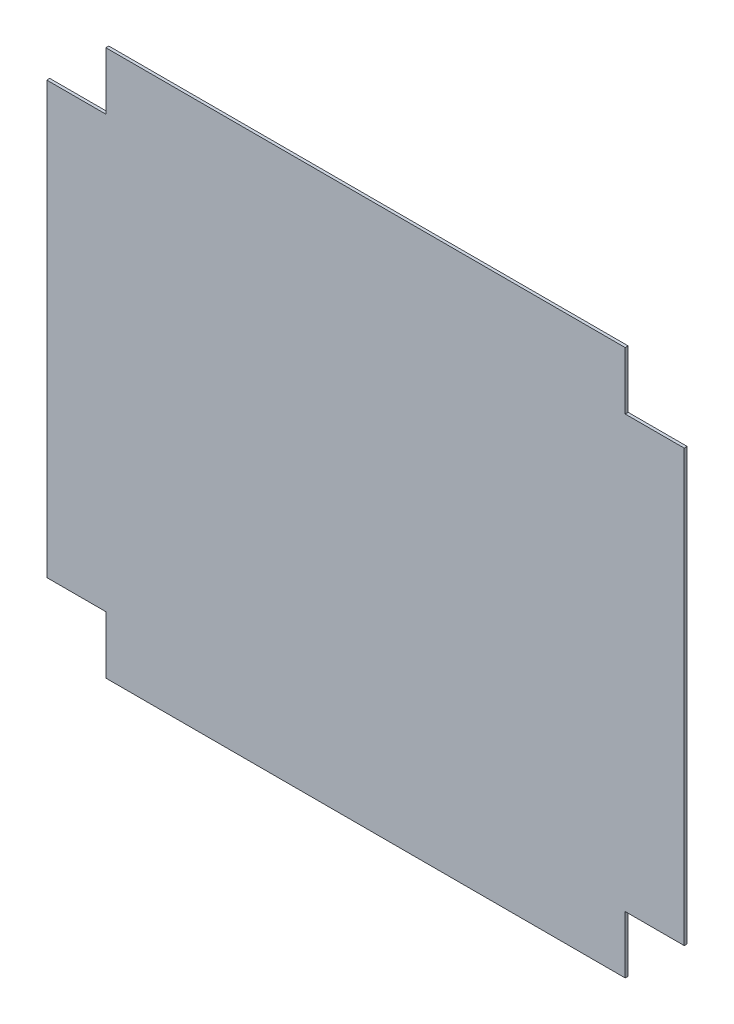
ISO-10303-21;
HEADER;
FILE_DESCRIPTION(('STEP AP214'),'2;1');
FILE_NAME('part.step','',(''),(''),'','','');
FILE_SCHEMA(('AUTOMOTIVE_DESIGN { 1 0 10303 214 1 1 1 1 }'));
ENDSEC;
DATA;
#1=APPLICATION_CONTEXT('core data for automotive mechanical design processes');
#2=APPLICATION_PROTOCOL_DEFINITION('international standard','automotive_design',2000,#1);
#3=PRODUCT_CONTEXT('',#1,'mechanical');
#4=PRODUCT('Part','Part','',(#3));
#5=PRODUCT_RELATED_PRODUCT_CATEGORY('part','',(#4));
#6=PRODUCT_DEFINITION_FORMATION('','',#4);
#7=PRODUCT_DEFINITION_CONTEXT('part definition',#1,'design');
#8=PRODUCT_DEFINITION('design','',#6,#7);
#9=PRODUCT_DEFINITION_SHAPE('','',#8);
#10=(LENGTH_UNIT() NAMED_UNIT(*) SI_UNIT(.MILLI.,.METRE.));
#11=(NAMED_UNIT(*) PLANE_ANGLE_UNIT() SI_UNIT($,.RADIAN.));
#12=(NAMED_UNIT(*) SI_UNIT($,.STERADIAN.) SOLID_ANGLE_UNIT());
#13=UNCERTAINTY_MEASURE_WITH_UNIT(LENGTH_MEASURE(1.E-05),#10,'distance_accuracy_value','');
#14=(GEOMETRIC_REPRESENTATION_CONTEXT(3) GLOBAL_UNCERTAINTY_ASSIGNED_CONTEXT((#13)) GLOBAL_UNIT_ASSIGNED_CONTEXT((#10,
#11,#12)) REPRESENTATION_CONTEXT('',''));
#15=CARTESIAN_POINT('',(0.,0.,0.));
#16=DIRECTION('',(0.,0.,1.));
#17=DIRECTION('',(1.,0.,0.));
#18=AXIS2_PLACEMENT_3D('',#15,#16,#17);
#19=CARTESIAN_POINT('',(-216.,-185.,2.));
#20=DIRECTION('',(1.,0.,0.));
#21=DIRECTION('',(0.,0.,-1.));
#22=AXIS2_PLACEMENT_3D('',#19,#20,#21);
#23=PLANE('',#22);
#24=DIRECTION('',(0.,-1.,0.));
#25=VECTOR('',#24,1.);
#26=CARTESIAN_POINT('',(-216.,-185.,0.));
#27=LINE('',#26,#25);
#28=CARTESIAN_POINT('',(-216.,146.,0.));
#29=VERTEX_POINT('',#28);
#30=CARTESIAN_POINT('',(-216.,-146.,0.));
#31=VERTEX_POINT('',#30);
#32=EDGE_CURVE('E167',#29,#31,#27,.T.);
#33=ORIENTED_EDGE('',*,*,#32,.T.);
#34=DIRECTION('',(0.,0.,1.));
#35=VECTOR('',#34,1.);
#36=CARTESIAN_POINT('',(-216.,-146.,0.));
#37=LINE('',#36,#35);
#38=CARTESIAN_POINT('',(-216.,-146.,2.));
#39=VERTEX_POINT('',#38);
#40=EDGE_CURVE('E209',#31,#39,#37,.T.);
#41=ORIENTED_EDGE('',*,*,#40,.T.);
#42=DIRECTION('',(0.,-1.,0.));
#43=VECTOR('',#42,1.);
#44=CARTESIAN_POINT('',(-216.,-185.,2.));
#45=LINE('',#44,#43);
#46=CARTESIAN_POINT('',(-216.,146.,2.));
#47=VERTEX_POINT('',#46);
#48=EDGE_CURVE('E163',#47,#39,#45,.T.);
#49=ORIENTED_EDGE('',*,*,#48,.F.);
#50=DIRECTION('',(0.,0.,1.));
#51=VECTOR('',#50,1.);
#52=CARTESIAN_POINT('',(-216.,146.,0.));
#53=LINE('',#52,#51);
#54=EDGE_CURVE('E182',#29,#47,#53,.T.);
#55=ORIENTED_EDGE('',*,*,#54,.F.);
#56=EDGE_LOOP('',(#33,#41,#49,#55));
#57=FACE_BOUND('',#56,.T.);
#58=ADVANCED_FACE('F43',(#57),#23,.F.);
#59=CARTESIAN_POINT('',(216.,-185.,2.));
#60=DIRECTION('',(0.,1.,0.));
#61=DIRECTION('',(-1.,0.,0.));
#62=AXIS2_PLACEMENT_3D('',#59,#60,#61);
#63=PLANE('',#62);
#64=DIRECTION('',(1.,0.,0.));
#65=VECTOR('',#64,1.);
#66=CARTESIAN_POINT('',(216.,-185.,2.));
#67=LINE('',#66,#65);
#68=CARTESIAN_POINT('',(-176.,-185.,2.));
#69=VERTEX_POINT('',#68);
#70=CARTESIAN_POINT('',(176.,-185.,2.));
#71=VERTEX_POINT('',#70);
#72=EDGE_CURVE('E160',#69,#71,#67,.T.);
#73=ORIENTED_EDGE('',*,*,#72,.F.);
#74=DIRECTION('',(0.,0.,1.));
#75=VECTOR('',#74,1.);
#76=CARTESIAN_POINT('',(-176.,-185.,0.));
#77=LINE('',#76,#75);
#78=CARTESIAN_POINT('',(-176.,-185.,0.));
#79=VERTEX_POINT('',#78);
#80=EDGE_CURVE('E203',#79,#69,#77,.T.);
#81=ORIENTED_EDGE('',*,*,#80,.F.);
#82=DIRECTION('',(1.,0.,0.));
#83=VECTOR('',#82,1.);
#84=CARTESIAN_POINT('',(216.,-185.,0.));
#85=LINE('',#84,#83);
#86=CARTESIAN_POINT('',(176.,-185.,0.));
#87=VERTEX_POINT('',#86);
#88=EDGE_CURVE('E170',#79,#87,#85,.T.);
#89=ORIENTED_EDGE('',*,*,#88,.T.);
#90=DIRECTION('',(0.,0.,1.));
#91=VECTOR('',#90,1.);
#92=CARTESIAN_POINT('',(176.,-185.,0.));
#93=LINE('',#92,#91);
#94=EDGE_CURVE('E207',#87,#71,#93,.T.);
#95=ORIENTED_EDGE('',*,*,#94,.T.);
#96=EDGE_LOOP('',(#73,#81,#89,#95));
#97=FACE_BOUND('',#96,.T.);
#98=ADVANCED_FACE('F258',(#97),#63,.F.);
#99=CARTESIAN_POINT('',(216.,-185.,2.));
#100=DIRECTION('',(-1.,0.,0.));
#101=DIRECTION('',(0.,0.,1.));
#102=AXIS2_PLACEMENT_3D('',#99,#100,#101);
#103=PLANE('',#102);
#104=DIRECTION('',(0.,1.,0.));
#105=VECTOR('',#104,1.);
#106=CARTESIAN_POINT('',(216.,-185.,2.));
#107=LINE('',#106,#105);
#108=CARTESIAN_POINT('',(216.,-146.,2.));
#109=VERTEX_POINT('',#108);
#110=CARTESIAN_POINT('',(216.,146.,2.));
#111=VERTEX_POINT('',#110);
#112=EDGE_CURVE('E51',#109,#111,#107,.T.);
#113=ORIENTED_EDGE('',*,*,#112,.F.);
#114=DIRECTION('',(0.,0.,1.));
#115=VECTOR('',#114,1.);
#116=CARTESIAN_POINT('',(216.,-146.,0.));
#117=LINE('',#116,#115);
#118=CARTESIAN_POINT('',(216.,-146.,0.));
#119=VERTEX_POINT('',#118);
#120=EDGE_CURVE('E220',#119,#109,#117,.T.);
#121=ORIENTED_EDGE('',*,*,#120,.F.);
#122=DIRECTION('',(0.,1.,0.));
#123=VECTOR('',#122,1.);
#124=CARTESIAN_POINT('',(216.,-185.,0.));
#125=LINE('',#124,#123);
#126=CARTESIAN_POINT('',(216.,146.,0.));
#127=VERTEX_POINT('',#126);
#128=EDGE_CURVE('E152',#119,#127,#125,.T.);
#129=ORIENTED_EDGE('',*,*,#128,.T.);
#130=DIRECTION('',(0.,0.,1.));
#131=VECTOR('',#130,1.);
#132=CARTESIAN_POINT('',(216.,146.,0.));
#133=LINE('',#132,#131);
#134=EDGE_CURVE('E135',#127,#111,#133,.T.);
#135=ORIENTED_EDGE('',*,*,#134,.T.);
#136=EDGE_LOOP('',(#113,#121,#129,#135));
#137=FACE_BOUND('',#136,.T.);
#138=ADVANCED_FACE('F149',(#137),#103,.F.);
#139=CARTESIAN_POINT('',(216.,185.,2.));
#140=DIRECTION('',(0.,-1.,0.));
#141=DIRECTION('',(1.,0.,0.));
#142=AXIS2_PLACEMENT_3D('',#139,#140,#141);
#143=PLANE('',#142);
#144=DIRECTION('',(-1.,0.,0.));
#145=VECTOR('',#144,1.);
#146=CARTESIAN_POINT('',(216.,185.,2.));
#147=LINE('',#146,#145);
#148=CARTESIAN_POINT('',(176.,185.,2.));
#149=VERTEX_POINT('',#148);
#150=CARTESIAN_POINT('',(-176.,185.,2.));
#151=VERTEX_POINT('',#150);
#152=EDGE_CURVE('E11',#149,#151,#147,.T.);
#153=ORIENTED_EDGE('',*,*,#152,.F.);
#154=DIRECTION('',(0.,0.,1.));
#155=VECTOR('',#154,1.);
#156=CARTESIAN_POINT('',(176.,185.,0.));
#157=LINE('',#156,#155);
#158=CARTESIAN_POINT('',(176.,185.,0.));
#159=VERTEX_POINT('',#158);
#160=EDGE_CURVE('E232',#159,#149,#157,.T.);
#161=ORIENTED_EDGE('',*,*,#160,.F.);
#162=DIRECTION('',(-1.,0.,0.));
#163=VECTOR('',#162,1.);
#164=CARTESIAN_POINT('',(216.,185.,0.));
#165=LINE('',#164,#163);
#166=CARTESIAN_POINT('',(-176.,185.,0.));
#167=VERTEX_POINT('',#166);
#168=EDGE_CURVE('E46',#159,#167,#165,.T.);
#169=ORIENTED_EDGE('',*,*,#168,.T.);
#170=DIRECTION('',(0.,0.,1.));
#171=VECTOR('',#170,1.);
#172=CARTESIAN_POINT('',(-176.,185.,0.));
#173=LINE('',#172,#171);
#174=EDGE_CURVE('E171',#167,#151,#173,.T.);
#175=ORIENTED_EDGE('',*,*,#174,.T.);
#176=EDGE_LOOP('',(#153,#161,#169,#175));
#177=FACE_BOUND('',#176,.T.);
#178=ADVANCED_FACE('F239',(#177),#143,.F.);
#179=CARTESIAN_POINT('',(0.,0.,2.));
#180=DIRECTION('',(0.,0.,1.));
#181=DIRECTION('',(1.,0.,0.));
#182=AXIS2_PLACEMENT_3D('',#179,#180,#181);
#183=PLANE('',#182);
#184=DIRECTION('',(-1.,0.,0.));
#185=VECTOR('',#184,1.);
#186=CARTESIAN_POINT('',(-216.,-146.,2.));
#187=LINE('',#186,#185);
#188=CARTESIAN_POINT('',(-176.,-146.,2.));
#189=VERTEX_POINT('',#188);
#190=EDGE_CURVE('E201',#189,#39,#187,.T.);
#191=ORIENTED_EDGE('',*,*,#190,.F.);
#192=DIRECTION('',(0.,1.,0.));
#193=VECTOR('',#192,1.);
#194=CARTESIAN_POINT('',(-176.,-185.,2.));
#195=LINE('',#194,#193);
#196=EDGE_CURVE('E204',#69,#189,#195,.T.);
#197=ORIENTED_EDGE('',*,*,#196,.F.);
#198=ORIENTED_EDGE('',*,*,#72,.T.);
#199=DIRECTION('',(0.,-1.,0.));
#200=VECTOR('',#199,1.);
#201=CARTESIAN_POINT('',(176.,-185.,2.));
#202=LINE('',#201,#200);
#203=CARTESIAN_POINT('',(176.,-146.,2.));
#204=VERTEX_POINT('',#203);
#205=EDGE_CURVE('E218',#204,#71,#202,.T.);
#206=ORIENTED_EDGE('',*,*,#205,.F.);
#207=DIRECTION('',(-1.,0.,0.));
#208=VECTOR('',#207,1.);
#209=CARTESIAN_POINT('',(216.,-146.,2.));
#210=LINE('',#209,#208);
#211=EDGE_CURVE('E153',#109,#204,#210,.T.);
#212=ORIENTED_EDGE('',*,*,#211,.F.);
#213=ORIENTED_EDGE('',*,*,#112,.T.);
#214=DIRECTION('',(1.,0.,0.));
#215=VECTOR('',#214,1.);
#216=CARTESIAN_POINT('',(216.,146.,2.));
#217=LINE('',#216,#215);
#218=CARTESIAN_POINT('',(176.,146.,2.));
#219=VERTEX_POINT('',#218);
#220=EDGE_CURVE('E132',#219,#111,#217,.T.);
#221=ORIENTED_EDGE('',*,*,#220,.F.);
#222=DIRECTION('',(0.,-1.,0.));
#223=VECTOR('',#222,1.);
#224=CARTESIAN_POINT('',(176.,185.,2.));
#225=LINE('',#224,#223);
#226=EDGE_CURVE('E143',#149,#219,#225,.T.);
#227=ORIENTED_EDGE('',*,*,#226,.F.);
#228=ORIENTED_EDGE('',*,*,#152,.T.);
#229=DIRECTION('',(0.,1.,0.));
#230=VECTOR('',#229,1.);
#231=CARTESIAN_POINT('',(-176.,185.,2.));
#232=LINE('',#231,#230);
#233=CARTESIAN_POINT('',(-176.,146.,2.));
#234=VERTEX_POINT('',#233);
#235=EDGE_CURVE('E188',#234,#151,#232,.T.);
#236=ORIENTED_EDGE('',*,*,#235,.F.);
#237=DIRECTION('',(1.,0.,0.));
#238=VECTOR('',#237,1.);
#239=CARTESIAN_POINT('',(-216.,146.,2.));
#240=LINE('',#239,#238);
#241=EDGE_CURVE('E191',#47,#234,#240,.T.);
#242=ORIENTED_EDGE('',*,*,#241,.F.);
#243=ORIENTED_EDGE('',*,*,#48,.T.);
#244=EDGE_LOOP('',(#191,#197,#198,#206,#212,#213,#221,#227,#228,#236,#242,#243));
#245=FACE_BOUND('',#244,.T.);
#246=ADVANCED_FACE('F157',(#245),#183,.T.);
#247=CARTESIAN_POINT('',(0.,0.,0.));
#248=DIRECTION('',(0.,0.,1.));
#249=DIRECTION('',(1.,0.,0.));
#250=AXIS2_PLACEMENT_3D('',#247,#248,#249);
#251=PLANE('',#250);
#252=DIRECTION('',(0.,1.,0.));
#253=VECTOR('',#252,1.);
#254=CARTESIAN_POINT('',(-176.,-185.,0.));
#255=LINE('',#254,#253);
#256=CARTESIAN_POINT('',(-176.,-146.,0.));
#257=VERTEX_POINT('',#256);
#258=EDGE_CURVE('E198',#79,#257,#255,.T.);
#259=ORIENTED_EDGE('',*,*,#258,.T.);
#260=DIRECTION('',(-1.,0.,0.));
#261=VECTOR('',#260,1.);
#262=CARTESIAN_POINT('',(-216.,-146.,0.));
#263=LINE('',#262,#261);
#264=EDGE_CURVE('E59',#257,#31,#263,.T.);
#265=ORIENTED_EDGE('',*,*,#264,.T.);
#266=ORIENTED_EDGE('',*,*,#32,.F.);
#267=DIRECTION('',(1.,0.,0.));
#268=VECTOR('',#267,1.);
#269=CARTESIAN_POINT('',(-216.,146.,0.));
#270=LINE('',#269,#268);
#271=CARTESIAN_POINT('',(-176.,146.,0.));
#272=VERTEX_POINT('',#271);
#273=EDGE_CURVE('E190',#29,#272,#270,.T.);
#274=ORIENTED_EDGE('',*,*,#273,.T.);
#275=DIRECTION('',(0.,1.,0.));
#276=VECTOR('',#275,1.);
#277=CARTESIAN_POINT('',(-176.,185.,0.));
#278=LINE('',#277,#276);
#279=EDGE_CURVE('E185',#272,#167,#278,.T.);
#280=ORIENTED_EDGE('',*,*,#279,.T.);
#281=ORIENTED_EDGE('',*,*,#168,.F.);
#282=DIRECTION('',(0.,-1.,0.));
#283=VECTOR('',#282,1.);
#284=CARTESIAN_POINT('',(176.,185.,0.));
#285=LINE('',#284,#283);
#286=CARTESIAN_POINT('',(176.,146.,0.));
#287=VERTEX_POINT('',#286);
#288=EDGE_CURVE('E144',#159,#287,#285,.T.);
#289=ORIENTED_EDGE('',*,*,#288,.T.);
#290=DIRECTION('',(1.,0.,0.));
#291=VECTOR('',#290,1.);
#292=CARTESIAN_POINT('',(216.,146.,0.));
#293=LINE('',#292,#291);
#294=EDGE_CURVE('E230',#287,#127,#293,.T.);
#295=ORIENTED_EDGE('',*,*,#294,.T.);
#296=ORIENTED_EDGE('',*,*,#128,.F.);
#297=DIRECTION('',(-1.,0.,0.));
#298=VECTOR('',#297,1.);
#299=CARTESIAN_POINT('',(216.,-146.,0.));
#300=LINE('',#299,#298);
#301=CARTESIAN_POINT('',(176.,-146.,0.));
#302=VERTEX_POINT('',#301);
#303=EDGE_CURVE('E215',#119,#302,#300,.T.);
#304=ORIENTED_EDGE('',*,*,#303,.T.);
#305=DIRECTION('',(0.,-1.,0.));
#306=VECTOR('',#305,1.);
#307=CARTESIAN_POINT('',(176.,-185.,0.));
#308=LINE('',#307,#306);
#309=EDGE_CURVE('E67',#302,#87,#308,.T.);
#310=ORIENTED_EDGE('',*,*,#309,.T.);
#311=ORIENTED_EDGE('',*,*,#88,.F.);
#312=EDGE_LOOP('',(#259,#265,#266,#274,#280,#281,#289,#295,#296,#304,#310,#311));
#313=FACE_BOUND('',#312,.T.);
#314=ADVANCED_FACE('F244',(#313),#251,.F.);
#315=CARTESIAN_POINT('',(-176.,185.,0.));
#316=DIRECTION('',(1.,0.,0.));
#317=DIRECTION('',(0.,0.,-1.));
#318=AXIS2_PLACEMENT_3D('',#315,#316,#317);
#319=PLANE('',#318);
#320=ORIENTED_EDGE('',*,*,#235,.T.);
#321=ORIENTED_EDGE('',*,*,#174,.F.);
#322=ORIENTED_EDGE('',*,*,#279,.F.);
#323=DIRECTION('',(0.,0.,1.));
#324=VECTOR('',#323,1.);
#325=CARTESIAN_POINT('',(-176.,146.,0.));
#326=LINE('',#325,#324);
#327=EDGE_CURVE('E184',#272,#234,#326,.T.);
#328=ORIENTED_EDGE('',*,*,#327,.T.);
#329=EDGE_LOOP('',(#320,#321,#322,#328));
#330=FACE_BOUND('',#329,.T.);
#331=ADVANCED_FACE('F241',(#330),#319,.F.);
#332=CARTESIAN_POINT('',(-216.,146.,0.));
#333=DIRECTION('',(0.,-1.,0.));
#334=DIRECTION('',(0.,0.,-1.));
#335=AXIS2_PLACEMENT_3D('',#332,#333,#334);
#336=PLANE('',#335);
#337=ORIENTED_EDGE('',*,*,#241,.T.);
#338=ORIENTED_EDGE('',*,*,#327,.F.);
#339=ORIENTED_EDGE('',*,*,#273,.F.);
#340=ORIENTED_EDGE('',*,*,#54,.T.);
#341=EDGE_LOOP('',(#337,#338,#339,#340));
#342=FACE_BOUND('',#341,.T.);
#343=ADVANCED_FACE('F248',(#342),#336,.F.);
#344=CARTESIAN_POINT('',(216.,146.,0.));
#345=DIRECTION('',(0.,-1.,0.));
#346=DIRECTION('',(0.,0.,-1.));
#347=AXIS2_PLACEMENT_3D('',#344,#345,#346);
#348=PLANE('',#347);
#349=ORIENTED_EDGE('',*,*,#220,.T.);
#350=ORIENTED_EDGE('',*,*,#134,.F.);
#351=ORIENTED_EDGE('',*,*,#294,.F.);
#352=DIRECTION('',(0.,0.,1.));
#353=VECTOR('',#352,1.);
#354=CARTESIAN_POINT('',(176.,146.,0.));
#355=LINE('',#354,#353);
#356=EDGE_CURVE('E138',#287,#219,#355,.T.);
#357=ORIENTED_EDGE('',*,*,#356,.T.);
#358=EDGE_LOOP('',(#349,#350,#351,#357));
#359=FACE_BOUND('',#358,.T.);
#360=ADVANCED_FACE('F134',(#359),#348,.F.);
#361=CARTESIAN_POINT('',(176.,185.,0.));
#362=DIRECTION('',(-1.,0.,0.));
#363=DIRECTION('',(0.,0.,1.));
#364=AXIS2_PLACEMENT_3D('',#361,#362,#363);
#365=PLANE('',#364);
#366=ORIENTED_EDGE('',*,*,#226,.T.);
#367=ORIENTED_EDGE('',*,*,#356,.F.);
#368=ORIENTED_EDGE('',*,*,#288,.F.);
#369=ORIENTED_EDGE('',*,*,#160,.T.);
#370=EDGE_LOOP('',(#366,#367,#368,#369));
#371=FACE_BOUND('',#370,.T.);
#372=ADVANCED_FACE('F236',(#371),#365,.F.);
#373=CARTESIAN_POINT('',(176.,-185.,0.));
#374=DIRECTION('',(-1.,0.,0.));
#375=DIRECTION('',(0.,0.,1.));
#376=AXIS2_PLACEMENT_3D('',#373,#374,#375);
#377=PLANE('',#376);
#378=ORIENTED_EDGE('',*,*,#205,.T.);
#379=ORIENTED_EDGE('',*,*,#94,.F.);
#380=ORIENTED_EDGE('',*,*,#309,.F.);
#381=DIRECTION('',(0.,0.,1.));
#382=VECTOR('',#381,1.);
#383=CARTESIAN_POINT('',(176.,-146.,0.));
#384=LINE('',#383,#382);
#385=EDGE_CURVE('E225',#302,#204,#384,.T.);
#386=ORIENTED_EDGE('',*,*,#385,.T.);
#387=EDGE_LOOP('',(#378,#379,#380,#386));
#388=FACE_BOUND('',#387,.T.);
#389=ADVANCED_FACE('F259',(#388),#377,.F.);
#390=CARTESIAN_POINT('',(216.,-146.,0.));
#391=DIRECTION('',(0.,1.,0.));
#392=DIRECTION('',(0.,0.,1.));
#393=AXIS2_PLACEMENT_3D('',#390,#391,#392);
#394=PLANE('',#393);
#395=ORIENTED_EDGE('',*,*,#211,.T.);
#396=ORIENTED_EDGE('',*,*,#385,.F.);
#397=ORIENTED_EDGE('',*,*,#303,.F.);
#398=ORIENTED_EDGE('',*,*,#120,.T.);
#399=EDGE_LOOP('',(#395,#396,#397,#398));
#400=FACE_BOUND('',#399,.T.);
#401=ADVANCED_FACE('F261',(#400),#394,.F.);
#402=CARTESIAN_POINT('',(-216.,-146.,0.));
#403=DIRECTION('',(0.,1.,0.));
#404=DIRECTION('',(0.,0.,1.));
#405=AXIS2_PLACEMENT_3D('',#402,#403,#404);
#406=PLANE('',#405);
#407=ORIENTED_EDGE('',*,*,#190,.T.);
#408=ORIENTED_EDGE('',*,*,#40,.F.);
#409=ORIENTED_EDGE('',*,*,#264,.F.);
#410=DIRECTION('',(0.,0.,1.));
#411=VECTOR('',#410,1.);
#412=CARTESIAN_POINT('',(-176.,-146.,0.));
#413=LINE('',#412,#411);
#414=EDGE_CURVE('E212',#257,#189,#413,.T.);
#415=ORIENTED_EDGE('',*,*,#414,.T.);
#416=EDGE_LOOP('',(#407,#408,#409,#415));
#417=FACE_BOUND('',#416,.T.);
#418=ADVANCED_FACE('F250',(#417),#406,.F.);
#419=CARTESIAN_POINT('',(-176.,-185.,0.));
#420=DIRECTION('',(1.,0.,0.));
#421=DIRECTION('',(0.,0.,-1.));
#422=AXIS2_PLACEMENT_3D('',#419,#420,#421);
#423=PLANE('',#422);
#424=ORIENTED_EDGE('',*,*,#196,.T.);
#425=ORIENTED_EDGE('',*,*,#414,.F.);
#426=ORIENTED_EDGE('',*,*,#258,.F.);
#427=ORIENTED_EDGE('',*,*,#80,.T.);
#428=EDGE_LOOP('',(#424,#425,#426,#427));
#429=FACE_BOUND('',#428,.T.);
#430=ADVANCED_FACE('F254',(#429),#423,.F.);
#431=CLOSED_SHELL('',(#58,#98,#138,#178,#246,#314,#331,#343,#360,#372,#389,#401,#418,#430));
#432=MANIFOLD_SOLID_BREP('B2',#431);
#433=ADVANCED_BREP_SHAPE_REPRESENTATION('',(#18,#432),#14);
#434=SHAPE_DEFINITION_REPRESENTATION(#9,#433);
ENDSEC;
END-ISO-10303-21;
